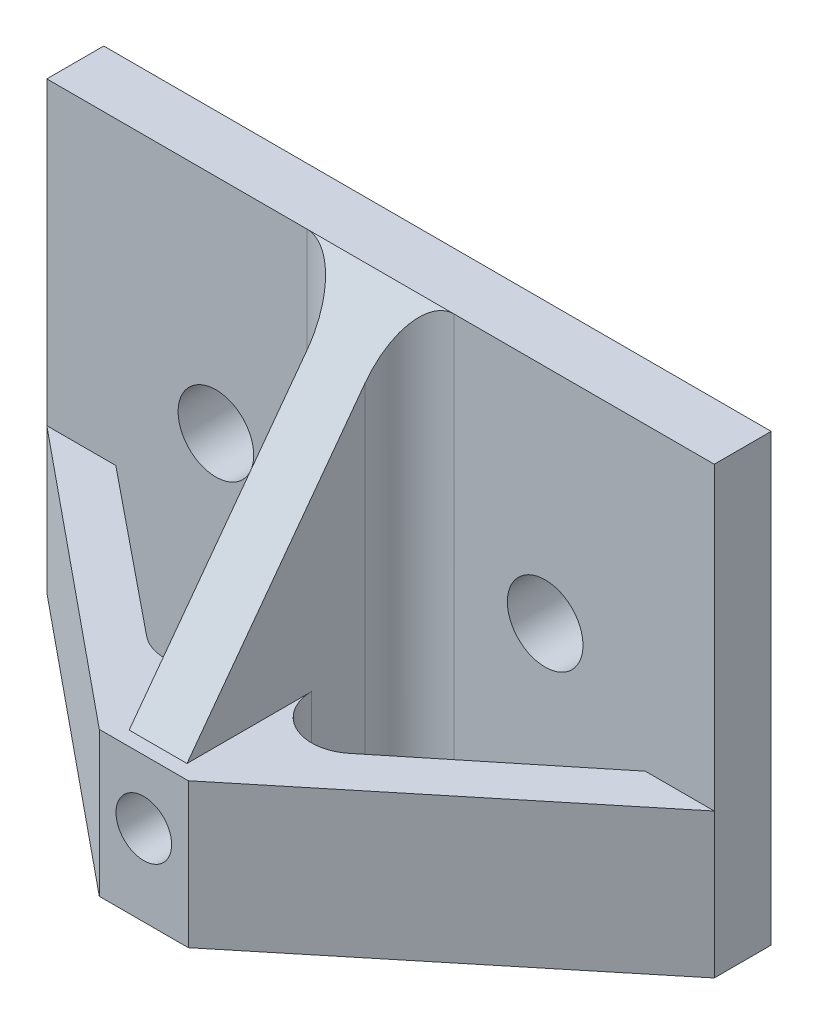
ISO-10303-21;
HEADER;
FILE_DESCRIPTION(('STEP AP214'),'2;1');
FILE_NAME('part.step','',(''),(''),'','','');
FILE_SCHEMA(('AUTOMOTIVE_DESIGN { 1 0 10303 214 1 1 1 1 }'));
ENDSEC;
DATA;
#1=APPLICATION_CONTEXT('core data for automotive mechanical design processes');
#2=APPLICATION_PROTOCOL_DEFINITION('international standard','automotive_design',2000,#1);
#3=PRODUCT_CONTEXT('',#1,'mechanical');
#4=PRODUCT('Part','Part','',(#3));
#5=PRODUCT_RELATED_PRODUCT_CATEGORY('part','',(#4));
#6=PRODUCT_DEFINITION_FORMATION('','',#4);
#7=PRODUCT_DEFINITION_CONTEXT('part definition',#1,'design');
#8=PRODUCT_DEFINITION('design','',#6,#7);
#9=PRODUCT_DEFINITION_SHAPE('','',#8);
#10=(LENGTH_UNIT() NAMED_UNIT(*) SI_UNIT(.MILLI.,.METRE.));
#11=(NAMED_UNIT(*) PLANE_ANGLE_UNIT() SI_UNIT($,.RADIAN.));
#12=(NAMED_UNIT(*) SI_UNIT($,.STERADIAN.) SOLID_ANGLE_UNIT());
#13=UNCERTAINTY_MEASURE_WITH_UNIT(LENGTH_MEASURE(1.E-05),#10,'distance_accuracy_value','');
#14=(GEOMETRIC_REPRESENTATION_CONTEXT(3) GLOBAL_UNCERTAINTY_ASSIGNED_CONTEXT((#13)) GLOBAL_UNIT_ASSIGNED_CONTEXT((#10,
#11,#12)) REPRESENTATION_CONTEXT('',''));
#15=CARTESIAN_POINT('',(0.,0.,0.));
#16=DIRECTION('',(0.,0.,1.));
#17=DIRECTION('',(1.,0.,0.));
#18=AXIS2_PLACEMENT_3D('',#15,#16,#17);
#19=CARTESIAN_POINT('',(-19.05,25.4,-8.382));
#20=DIRECTION('',(1.,0.,0.));
#21=DIRECTION('',(0.,0.,-1.));
#22=AXIS2_PLACEMENT_3D('',#19,#20,#21);
#23=PLANE('',#22);
#24=DIRECTION('',(0.,0.,1.));
#25=VECTOR('',#24,1.);
#26=CARTESIAN_POINT('',(-19.05,0.,-8.382));
#27=LINE('',#26,#25);
#28=CARTESIAN_POINT('',(-19.05,0.,-8.382));
#29=VERTEX_POINT('',#28);
#30=CARTESIAN_POINT('',(-19.05,0.,-5.13261416393379));
#31=VERTEX_POINT('',#30);
#32=EDGE_CURVE('E234',#29,#31,#27,.T.);
#33=ORIENTED_EDGE('',*,*,#32,.T.);
#34=DIRECTION('',(0.,-1.,0.));
#35=VECTOR('',#34,1.);
#36=CARTESIAN_POINT('',(-19.05,25.4,-5.13261416393379));
#37=LINE('',#36,#35);
#38=CARTESIAN_POINT('',(-19.05,8.255,-5.13261416393379));
#39=VERTEX_POINT('',#38);
#40=EDGE_CURVE('E231',#39,#31,#37,.T.);
#41=ORIENTED_EDGE('',*,*,#40,.F.);
#42=CARTESIAN_POINT('',(-19.05,25.4,-5.13261416393379));
#43=VERTEX_POINT('',#42);
#44=EDGE_CURVE('E235',#43,#39,#37,.T.);
#45=ORIENTED_EDGE('',*,*,#44,.F.);
#46=DIRECTION('',(0.,0.,1.));
#47=VECTOR('',#46,1.);
#48=CARTESIAN_POINT('',(-19.05,25.4,-8.382));
#49=LINE('',#48,#47);
#50=CARTESIAN_POINT('',(-19.05,25.4,-8.382));
#51=VERTEX_POINT('',#50);
#52=EDGE_CURVE('E194',#51,#43,#49,.T.);
#53=ORIENTED_EDGE('',*,*,#52,.F.);
#54=DIRECTION('',(0.,-1.,0.));
#55=VECTOR('',#54,1.);
#56=CARTESIAN_POINT('',(-19.05,25.4,-8.382));
#57=LINE('',#56,#55);
#58=EDGE_CURVE('E243',#51,#29,#57,.T.);
#59=ORIENTED_EDGE('',*,*,#58,.T.);
#60=EDGE_LOOP('',(#33,#41,#45,#53,#59));
#61=FACE_BOUND('',#60,.T.);
#62=ADVANCED_FACE('F33',(#61),#23,.F.);
#63=CARTESIAN_POINT('',(19.05,25.4,8.382));
#64=DIRECTION('',(0.,0.,-1.));
#65=DIRECTION('',(-1.,0.,0.));
#66=AXIS2_PLACEMENT_3D('',#63,#64,#65);
#67=PLANE('',#66);
#68=CARTESIAN_POINT('',(0.,4.62310389310775,8.382));
#69=DIRECTION('',(0.,0.,1.));
#70=DIRECTION('',(1.,0.,0.));
#71=AXIS2_PLACEMENT_3D('',#68,#69,#70);
#72=CIRCLE('',#71,1.5875);
#73=CARTESIAN_POINT('',(1.5875,4.62310389310775,8.382));
#74=VERTEX_POINT('',#73);
#75=EDGE_CURVE('E368',#74,#74,#72,.T.);
#76=ORIENTED_EDGE('',*,*,#75,.F.);
#77=EDGE_LOOP('',(#76));
#78=FACE_BOUND('',#77,.T.);
#79=DIRECTION('',(-1.,0.,0.));
#80=VECTOR('',#79,1.);
#81=CARTESIAN_POINT('',(19.05,8.255,8.382));
#82=LINE('',#81,#80);
#83=CARTESIAN_POINT('',(2.54,8.255,8.382));
#84=VERTEX_POINT('',#83);
#85=CARTESIAN_POINT('',(-2.54,8.255,8.382));
#86=VERTEX_POINT('',#85);
#87=EDGE_CURVE('E288',#84,#86,#82,.T.);
#88=ORIENTED_EDGE('',*,*,#87,.T.);
#89=DIRECTION('',(0.,-1.,0.));
#90=VECTOR('',#89,1.);
#91=CARTESIAN_POINT('',(-2.54,25.4,8.382));
#92=LINE('',#91,#90);
#93=CARTESIAN_POINT('',(-2.54,0.,8.382));
#94=VERTEX_POINT('',#93);
#95=EDGE_CURVE('E232',#86,#94,#92,.T.);
#96=ORIENTED_EDGE('',*,*,#95,.T.);
#97=DIRECTION('',(1.,0.,0.));
#98=VECTOR('',#97,1.);
#99=CARTESIAN_POINT('',(19.05,0.,8.382));
#100=LINE('',#99,#98);
#101=CARTESIAN_POINT('',(2.54000000000001,0.,8.382));
#102=VERTEX_POINT('',#101);
#103=EDGE_CURVE('E246',#94,#102,#100,.T.);
#104=ORIENTED_EDGE('',*,*,#103,.T.);
#105=DIRECTION('',(0.,-1.,0.));
#106=VECTOR('',#105,1.);
#107=CARTESIAN_POINT('',(2.54,25.4,8.382));
#108=LINE('',#107,#106);
#109=EDGE_CURVE('E223',#84,#102,#108,.T.);
#110=ORIENTED_EDGE('',*,*,#109,.F.);
#111=EDGE_LOOP('',(#88,#96,#104,#110));
#112=FACE_BOUND('',#111,.T.);
#113=ADVANCED_FACE('F382',(#78,#112),#67,.F.);
#114=CARTESIAN_POINT('',(19.05,25.4,-8.382));
#115=DIRECTION('',(-1.,0.,0.));
#116=DIRECTION('',(0.,0.,1.));
#117=AXIS2_PLACEMENT_3D('',#114,#115,#116);
#118=PLANE('',#117);
#119=DIRECTION('',(0.,0.,-1.));
#120=VECTOR('',#119,1.);
#121=CARTESIAN_POINT('',(19.05,25.4,-8.382));
#122=LINE('',#121,#120);
#123=CARTESIAN_POINT('',(19.05,25.4,-5.13261416393379));
#124=VERTEX_POINT('',#123);
#125=CARTESIAN_POINT('',(19.05,25.4,-8.382));
#126=VERTEX_POINT('',#125);
#127=EDGE_CURVE('E238',#124,#126,#122,.T.);
#128=ORIENTED_EDGE('',*,*,#127,.F.);
#129=DIRECTION('',(0.,-1.,0.));
#130=VECTOR('',#129,1.);
#131=CARTESIAN_POINT('',(19.05,25.4,-5.13261416393379));
#132=LINE('',#131,#130);
#133=CARTESIAN_POINT('',(19.05,8.255,-5.13261416393379));
#134=VERTEX_POINT('',#133);
#135=EDGE_CURVE('E226',#124,#134,#132,.T.);
#136=ORIENTED_EDGE('',*,*,#135,.T.);
#137=CARTESIAN_POINT('',(19.05,0.,-5.13261416393379));
#138=VERTEX_POINT('',#137);
#139=EDGE_CURVE('E222',#134,#138,#132,.T.);
#140=ORIENTED_EDGE('',*,*,#139,.T.);
#141=DIRECTION('',(0.,0.,-1.));
#142=VECTOR('',#141,1.);
#143=CARTESIAN_POINT('',(19.05,0.,-8.382));
#144=LINE('',#143,#142);
#145=CARTESIAN_POINT('',(19.05,0.,-8.382));
#146=VERTEX_POINT('',#145);
#147=EDGE_CURVE('E249',#138,#146,#144,.T.);
#148=ORIENTED_EDGE('',*,*,#147,.T.);
#149=DIRECTION('',(0.,-1.,0.));
#150=VECTOR('',#149,1.);
#151=CARTESIAN_POINT('',(19.05,25.4,-8.382));
#152=LINE('',#151,#150);
#153=EDGE_CURVE('E41',#126,#146,#152,.T.);
#154=ORIENTED_EDGE('',*,*,#153,.F.);
#155=EDGE_LOOP('',(#128,#136,#140,#148,#154));
#156=FACE_BOUND('',#155,.T.);
#157=ADVANCED_FACE('F339',(#156),#118,.F.);
#158=CARTESIAN_POINT('',(19.05,25.4,-8.382));
#159=DIRECTION('',(0.,0.,1.));
#160=DIRECTION('',(1.,0.,0.));
#161=AXIS2_PLACEMENT_3D('',#158,#159,#160);
#162=PLANE('',#161);
#163=CARTESIAN_POINT('',(-9.398,12.7,-8.382));
#164=DIRECTION('',(0.,0.,-1.));
#165=DIRECTION('',(1.,0.,0.));
#166=AXIS2_PLACEMENT_3D('',#163,#164,#165);
#167=CIRCLE('',#166,2.159);
#168=CARTESIAN_POINT('',(-7.239,12.7,-8.382));
#169=VERTEX_POINT('',#168);
#170=EDGE_CURVE('E269',#169,#169,#167,.T.);
#171=ORIENTED_EDGE('',*,*,#170,.F.);
#172=EDGE_LOOP('',(#171));
#173=FACE_BOUND('',#172,.T.);
#174=CARTESIAN_POINT('',(9.398,12.7,-8.382));
#175=DIRECTION('',(0.,0.,-1.));
#176=DIRECTION('',(-1.,0.,0.));
#177=AXIS2_PLACEMENT_3D('',#174,#175,#176);
#178=CIRCLE('',#177,2.159);
#179=CARTESIAN_POINT('',(7.239,12.7,-8.382));
#180=VERTEX_POINT('',#179);
#181=EDGE_CURVE('E258',#180,#180,#178,.T.);
#182=ORIENTED_EDGE('',*,*,#181,.F.);
#183=EDGE_LOOP('',(#182));
#184=FACE_BOUND('',#183,.T.);
#185=DIRECTION('',(-1.,0.,0.));
#186=VECTOR('',#185,1.);
#187=CARTESIAN_POINT('',(19.05,0.,-8.382));
#188=LINE('',#187,#186);
#189=EDGE_CURVE('E239',#146,#29,#188,.T.);
#190=ORIENTED_EDGE('',*,*,#189,.T.);
#191=ORIENTED_EDGE('',*,*,#58,.F.);
#192=DIRECTION('',(-1.,0.,0.));
#193=VECTOR('',#192,1.);
#194=CARTESIAN_POINT('',(19.05,25.4,-8.382));
#195=LINE('',#194,#193);
#196=EDGE_CURVE('E241',#126,#51,#195,.T.);
#197=ORIENTED_EDGE('',*,*,#196,.F.);
#198=ORIENTED_EDGE('',*,*,#153,.T.);
#199=EDGE_LOOP('',(#190,#191,#197,#198));
#200=FACE_BOUND('',#199,.T.);
#201=ADVANCED_FACE('F343',(#173,#184,#200),#162,.F.);
#202=CARTESIAN_POINT('',(0.,25.4,0.));
#203=DIRECTION('',(0.,-1.,0.));
#204=DIRECTION('',(0.,0.,-1.));
#205=AXIS2_PLACEMENT_3D('',#202,#203,#204);
#206=PLANE('',#205);
#207=DIRECTION('',(1.,0.,0.));
#208=VECTOR('',#207,1.);
#209=CARTESIAN_POINT('',(-4.191,25.4,-5.13261416393379));
#210=LINE('',#209,#208);
#211=CARTESIAN_POINT('',(-4.191,25.4,-5.13261416393379));
#212=VERTEX_POINT('',#211);
#213=EDGE_CURVE('E184',#43,#212,#210,.T.);
#214=ORIENTED_EDGE('',*,*,#213,.T.);
#215=DIRECTION('',(1.,0.,0.));
#216=VECTOR('',#215,1.);
#217=CARTESIAN_POINT('',(-19.05,25.4,-5.13261416393378));
#218=LINE('',#217,#216);
#219=CARTESIAN_POINT('',(4.191,25.4,-5.13261416393379));
#220=VERTEX_POINT('',#219);
#221=EDGE_CURVE('E158',#212,#220,#218,.T.);
#222=ORIENTED_EDGE('',*,*,#221,.T.);
#223=DIRECTION('',(1.,0.,0.));
#224=VECTOR('',#223,1.);
#225=CARTESIAN_POINT('',(4.191,25.4,-5.13261416393379));
#226=LINE('',#225,#224);
#227=EDGE_CURVE('E291',#220,#124,#226,.T.);
#228=ORIENTED_EDGE('',*,*,#227,.T.);
#229=ORIENTED_EDGE('',*,*,#127,.T.);
#230=ORIENTED_EDGE('',*,*,#196,.T.);
#231=ORIENTED_EDGE('',*,*,#52,.T.);
#232=EDGE_LOOP('',(#214,#222,#228,#229,#230,#231));
#233=FACE_BOUND('',#232,.T.);
#234=ADVANCED_FACE('F192',(#233),#206,.F.);
#235=CARTESIAN_POINT('',(0.,0.,0.));
#236=DIRECTION('',(0.,-1.,0.));
#237=DIRECTION('',(0.,0.,-1.));
#238=AXIS2_PLACEMENT_3D('',#235,#236,#237);
#239=PLANE('',#238);
#240=CARTESIAN_POINT('',(4.191,0.,0.455385836066213));
#241=DIRECTION('',(0.,-1.,0.));
#242=DIRECTION('',(0.,0.,1.));
#243=AXIS2_PLACEMENT_3D('',#240,#241,#242);
#244=CIRCLE('',#243,2.54);
#245=CARTESIAN_POINT('',(5.79099515260645,0.,2.42810363434246));
#246=VERTEX_POINT('',#245);
#247=CARTESIAN_POINT('',(1.651,0.,0.455385836066213));
#248=VERTEX_POINT('',#247);
#249=EDGE_CURVE('E290',#246,#248,#244,.T.);
#250=ORIENTED_EDGE('',*,*,#249,.F.);
#251=DIRECTION('',(-0.776660550502457,0.,0.629919351419862));
#252=VECTOR('',#251,1.);
#253=CARTESIAN_POINT('',(15.113,0.,-5.13261416393379));
#254=LINE('',#253,#252);
#255=CARTESIAN_POINT('',(15.113,0.,-5.13261416393379));
#256=VERTEX_POINT('',#255);
#257=EDGE_CURVE('E293',#256,#246,#254,.T.);
#258=ORIENTED_EDGE('',*,*,#257,.F.);
#259=DIRECTION('',(1.,0.,0.));
#260=VECTOR('',#259,1.);
#261=CARTESIAN_POINT('',(4.191,0.,-5.13261416393379));
#262=LINE('',#261,#260);
#263=CARTESIAN_POINT('',(4.191,0.,-5.13261416393379));
#264=VERTEX_POINT('',#263);
#265=EDGE_CURVE('E302',#264,#256,#262,.T.);
#266=ORIENTED_EDGE('',*,*,#265,.F.);
#267=CARTESIAN_POINT('',(4.191,0.,-2.59261416393379));
#268=DIRECTION('',(0.,-1.,0.));
#269=DIRECTION('',(0.,0.,-1.));
#270=AXIS2_PLACEMENT_3D('',#267,#268,#269);
#271=CIRCLE('',#270,2.54);
#272=CARTESIAN_POINT('',(1.651,0.,-2.59261416393379));
#273=VERTEX_POINT('',#272);
#274=EDGE_CURVE('E299',#273,#264,#271,.T.);
#275=ORIENTED_EDGE('',*,*,#274,.F.);
#276=DIRECTION('',(0.,0.,-1.));
#277=VECTOR('',#276,1.);
#278=CARTESIAN_POINT('',(1.651,0.,0.455385836066213));
#279=LINE('',#278,#277);
#280=EDGE_CURVE('E296',#248,#273,#279,.T.);
#281=ORIENTED_EDGE('',*,*,#280,.F.);
#282=EDGE_LOOP('',(#250,#258,#266,#275,#281));
#283=FACE_BOUND('',#282,.T.);
#284=CARTESIAN_POINT('',(-4.191,0.,0.455385836066213));
#285=DIRECTION('',(0.,-1.,0.));
#286=DIRECTION('',(0.,0.,-1.));
#287=AXIS2_PLACEMENT_3D('',#284,#285,#286);
#288=CIRCLE('',#287,2.54);
#289=CARTESIAN_POINT('',(-1.651,0.,0.455385836066213));
#290=VERTEX_POINT('',#289);
#291=CARTESIAN_POINT('',(-5.79099515260645,0.,2.42810363434246));
#292=VERTEX_POINT('',#291);
#293=EDGE_CURVE('E206',#290,#292,#288,.T.);
#294=ORIENTED_EDGE('',*,*,#293,.F.);
#295=DIRECTION('',(0.,0.,1.));
#296=VECTOR('',#295,1.);
#297=CARTESIAN_POINT('',(-1.651,0.,0.455385836066213));
#298=LINE('',#297,#296);
#299=CARTESIAN_POINT('',(-1.651,0.,-2.59261416393379));
#300=VERTEX_POINT('',#299);
#301=EDGE_CURVE('E196',#300,#290,#298,.T.);
#302=ORIENTED_EDGE('',*,*,#301,.F.);
#303=CARTESIAN_POINT('',(-4.191,0.,-2.59261416393379));
#304=DIRECTION('',(0.,-1.,0.));
#305=DIRECTION('',(0.,0.,1.));
#306=AXIS2_PLACEMENT_3D('',#303,#304,#305);
#307=CIRCLE('',#306,2.54);
#308=CARTESIAN_POINT('',(-4.191,0.,-5.13261416393379));
#309=VERTEX_POINT('',#308);
#310=EDGE_CURVE('E200',#309,#300,#307,.T.);
#311=ORIENTED_EDGE('',*,*,#310,.F.);
#312=DIRECTION('',(1.,0.,0.));
#313=VECTOR('',#312,1.);
#314=CARTESIAN_POINT('',(-4.191,0.,-5.13261416393379));
#315=LINE('',#314,#313);
#316=CARTESIAN_POINT('',(-15.113,0.,-5.13261416393379));
#317=VERTEX_POINT('',#316);
#318=EDGE_CURVE('E187',#317,#309,#315,.T.);
#319=ORIENTED_EDGE('',*,*,#318,.F.);
#320=DIRECTION('',(-0.776660550502457,0.,-0.629919351419862));
#321=VECTOR('',#320,1.);
#322=CARTESIAN_POINT('',(-15.113,0.,-5.13261416393379));
#323=LINE('',#322,#321);
#324=EDGE_CURVE('E209',#292,#317,#323,.T.);
#325=ORIENTED_EDGE('',*,*,#324,.F.);
#326=EDGE_LOOP('',(#294,#302,#311,#319,#325));
#327=FACE_BOUND('',#326,.T.);
#328=DIRECTION('',(0.773809523809524,0.,-0.633418361639192));
#329=VECTOR('',#328,1.);
#330=CARTESIAN_POINT('',(2.54,0.,8.382));
#331=LINE('',#330,#329);
#332=EDGE_CURVE('E217',#102,#138,#331,.T.);
#333=ORIENTED_EDGE('',*,*,#332,.F.);
#334=ORIENTED_EDGE('',*,*,#103,.F.);
#335=DIRECTION('',(0.773809523809524,0.,0.633418361639192));
#336=VECTOR('',#335,1.);
#337=CARTESIAN_POINT('',(-2.54,0.,8.382));
#338=LINE('',#337,#336);
#339=EDGE_CURVE('E225',#31,#94,#338,.T.);
#340=ORIENTED_EDGE('',*,*,#339,.F.);
#341=ORIENTED_EDGE('',*,*,#32,.F.);
#342=ORIENTED_EDGE('',*,*,#189,.F.);
#343=ORIENTED_EDGE('',*,*,#147,.F.);
#344=EDGE_LOOP('',(#333,#334,#340,#341,#342,#343));
#345=FACE_BOUND('',#344,.T.);
#346=ADVANCED_FACE('F324',(#283,#327,#345),#239,.T.);
#347=CARTESIAN_POINT('',(-2.54,25.4,8.382));
#348=DIRECTION('',(0.633418361639192,0.,-0.773809523809524));
#349=DIRECTION('',(-0.773809523809524,0.,-0.633418361639192));
#350=AXIS2_PLACEMENT_3D('',#347,#348,#349);
#351=PLANE('',#350);
#352=ORIENTED_EDGE('',*,*,#95,.F.);
#353=DIRECTION('',(-0.773809523809524,0.,-0.633418361639192));
#354=VECTOR('',#353,1.);
#355=CARTESIAN_POINT('',(-2.54,8.255,8.382));
#356=LINE('',#355,#354);
#357=EDGE_CURVE('E275',#86,#39,#356,.T.);
#358=ORIENTED_EDGE('',*,*,#357,.T.);
#359=ORIENTED_EDGE('',*,*,#40,.T.);
#360=ORIENTED_EDGE('',*,*,#339,.T.);
#361=EDGE_LOOP('',(#352,#358,#359,#360));
#362=FACE_BOUND('',#361,.T.);
#363=ADVANCED_FACE('F390',(#362),#351,.F.);
#364=CARTESIAN_POINT('',(2.54,25.4,8.382));
#365=DIRECTION('',(-0.633418361639192,0.,-0.773809523809524));
#366=DIRECTION('',(-0.773809523809524,0.,0.633418361639192));
#367=AXIS2_PLACEMENT_3D('',#364,#365,#366);
#368=PLANE('',#367);
#369=ORIENTED_EDGE('',*,*,#139,.F.);
#370=DIRECTION('',(-0.773809523809524,0.,0.633418361639192));
#371=VECTOR('',#370,1.);
#372=CARTESIAN_POINT('',(2.54,8.255,8.382));
#373=LINE('',#372,#371);
#374=EDGE_CURVE('E286',#134,#84,#373,.T.);
#375=ORIENTED_EDGE('',*,*,#374,.T.);
#376=ORIENTED_EDGE('',*,*,#109,.T.);
#377=ORIENTED_EDGE('',*,*,#332,.T.);
#378=EDGE_LOOP('',(#369,#375,#376,#377));
#379=FACE_BOUND('',#378,.T.);
#380=ADVANCED_FACE('F396',(#379),#368,.F.);
#381=CARTESIAN_POINT('',(-4.191,25.4,0.455385836066213));
#382=DIRECTION('',(0.,-1.,0.));
#383=DIRECTION('',(0.,0.,-1.));
#384=AXIS2_PLACEMENT_3D('',#381,#382,#383);
#385=CYLINDRICAL_SURFACE('',#384,2.54);
#386=DIRECTION('',(0.,-1.,0.));
#387=VECTOR('',#386,1.);
#388=CARTESIAN_POINT('',(-5.79099515260645,25.4,2.42810363434246));
#389=LINE('',#388,#387);
#390=CARTESIAN_POINT('',(-5.79099515260645,8.255,2.42810363434246));
#391=VERTEX_POINT('',#390);
#392=EDGE_CURVE('E195',#391,#292,#389,.T.);
#393=ORIENTED_EDGE('',*,*,#392,.F.);
#394=CARTESIAN_POINT('',(-4.191,8.255,0.455385836066213));
#395=DIRECTION('',(0.,-1.,0.));
#396=DIRECTION('',(0.,0.,-1.));
#397=AXIS2_PLACEMENT_3D('',#394,#395,#396);
#398=CIRCLE('',#397,2.54);
#399=CARTESIAN_POINT('',(-1.651,8.255,0.455385836066213));
#400=VERTEX_POINT('',#399);
#401=EDGE_CURVE('E49',#391,#400,#398,.F.);
#402=ORIENTED_EDGE('',*,*,#401,.T.);
#403=DIRECTION('',(0.,-1.,0.));
#404=VECTOR('',#403,1.);
#405=CARTESIAN_POINT('',(-1.651,25.4,0.455385836066213));
#406=LINE('',#405,#404);
#407=EDGE_CURVE('E215',#400,#290,#406,.T.);
#408=ORIENTED_EDGE('',*,*,#407,.T.);
#409=ORIENTED_EDGE('',*,*,#293,.T.);
#410=EDGE_LOOP('',(#393,#402,#408,#409));
#411=FACE_BOUND('',#410,.T.);
#412=ADVANCED_FACE('F400',(#411),#385,.F.);
#413=CARTESIAN_POINT('',(-1.651,25.4,0.455385836066213));
#414=DIRECTION('',(1.,0.,0.));
#415=DIRECTION('',(0.,0.,-1.));
#416=AXIS2_PLACEMENT_3D('',#413,#414,#415);
#417=PLANE('',#416);
#418=DIRECTION('',(0.,0.,-1.));
#419=VECTOR('',#418,1.);
#420=CARTESIAN_POINT('',(-1.651,8.255,0.455385836066213));
#421=LINE('',#420,#419);
#422=CARTESIAN_POINT('',(-1.651,8.255,7.56675082019042));
#423=VERTEX_POINT('',#422);
#424=EDGE_CURVE('E262',#423,#400,#421,.T.);
#425=ORIENTED_EDGE('',*,*,#424,.F.);
#426=DIRECTION('',(0.,0.803571428571429,-0.595208332589248));
#427=VECTOR('',#426,1.);
#428=CARTESIAN_POINT('',(-1.651,22.7273020122698,-3.15293686801542));
#429=LINE('',#428,#427);
#430=CARTESIAN_POINT('',(-1.651,21.9708285371402,-2.59261416393379));
#431=VERTEX_POINT('',#430);
#432=EDGE_CURVE('E179',#423,#431,#429,.T.);
#433=ORIENTED_EDGE('',*,*,#432,.T.);
#434=DIRECTION('',(0.,-1.,0.));
#435=VECTOR('',#434,1.);
#436=CARTESIAN_POINT('',(-1.651,25.4,-2.59261416393379));
#437=LINE('',#436,#435);
#438=EDGE_CURVE('E178',#431,#300,#437,.T.);
#439=ORIENTED_EDGE('',*,*,#438,.T.);
#440=ORIENTED_EDGE('',*,*,#301,.T.);
#441=ORIENTED_EDGE('',*,*,#407,.F.);
#442=EDGE_LOOP('',(#425,#433,#439,#440,#441));
#443=FACE_BOUND('',#442,.T.);
#444=ADVANCED_FACE('F360',(#443),#417,.F.);
#445=CARTESIAN_POINT('',(-4.191,25.4,-2.59261416393379));
#446=DIRECTION('',(0.,-1.,0.));
#447=DIRECTION('',(0.,0.,-1.));
#448=AXIS2_PLACEMENT_3D('',#445,#446,#447);
#449=CYLINDRICAL_SURFACE('',#448,2.54);
#450=ORIENTED_EDGE('',*,*,#438,.F.);
#451=CARTESIAN_POINT('',(-4.191,21.9708285371402,-2.59261416393379));
#452=DIRECTION('',(0.,-0.595208332589248,-0.803571428571429));
#453=DIRECTION('',(0.,-0.803571428571429,0.595208332589248));
#454=AXIS2_PLACEMENT_3D('',#451,#452,#453);
#455=ELLIPSE('',#454,4.26741337600334,2.54);
#456=EDGE_CURVE('E161',#431,#212,#455,.F.);
#457=ORIENTED_EDGE('',*,*,#456,.T.);
#458=DIRECTION('',(0.,-1.,0.));
#459=VECTOR('',#458,1.);
#460=CARTESIAN_POINT('',(-4.191,25.4,-5.13261416393379));
#461=LINE('',#460,#459);
#462=EDGE_CURVE('E176',#212,#309,#461,.T.);
#463=ORIENTED_EDGE('',*,*,#462,.T.);
#464=ORIENTED_EDGE('',*,*,#310,.T.);
#465=EDGE_LOOP('',(#450,#457,#463,#464));
#466=FACE_BOUND('',#465,.T.);
#467=ADVANCED_FACE('F174',(#466),#449,.F.);
#468=CARTESIAN_POINT('',(-4.191,25.4,-5.13261416393379));
#469=DIRECTION('',(0.,0.,-1.));
#470=DIRECTION('',(-1.,0.,0.));
#471=AXIS2_PLACEMENT_3D('',#468,#469,#470);
#472=PLANE('',#471);
#473=CARTESIAN_POINT('',(-9.398,12.7,-5.13261416393379));
#474=DIRECTION('',(0.,0.,-1.));
#475=DIRECTION('',(-1.,0.,0.));
#476=AXIS2_PLACEMENT_3D('',#473,#474,#475);
#477=CIRCLE('',#476,2.159);
#478=CARTESIAN_POINT('',(-11.557,12.7,-5.13261416393379));
#479=VERTEX_POINT('',#478);
#480=EDGE_CURVE('E36',#479,#479,#477,.T.);
#481=ORIENTED_EDGE('',*,*,#480,.T.);
#482=EDGE_LOOP('',(#481));
#483=FACE_BOUND('',#482,.T.);
#484=ORIENTED_EDGE('',*,*,#318,.T.);
#485=ORIENTED_EDGE('',*,*,#462,.F.);
#486=ORIENTED_EDGE('',*,*,#213,.F.);
#487=ORIENTED_EDGE('',*,*,#44,.T.);
#488=DIRECTION('',(-1.,0.,0.));
#489=VECTOR('',#488,1.);
#490=CARTESIAN_POINT('',(-19.05,8.255,-5.13261416393379));
#491=LINE('',#490,#489);
#492=CARTESIAN_POINT('',(-15.113,8.255,-5.13261416393379));
#493=VERTEX_POINT('',#492);
#494=EDGE_CURVE('E257',#493,#39,#491,.T.);
#495=ORIENTED_EDGE('',*,*,#494,.F.);
#496=DIRECTION('',(0.,-1.,0.));
#497=VECTOR('',#496,1.);
#498=CARTESIAN_POINT('',(-15.113,25.4,-5.13261416393379));
#499=LINE('',#498,#497);
#500=EDGE_CURVE('E189',#493,#317,#499,.T.);
#501=ORIENTED_EDGE('',*,*,#500,.T.);
#502=EDGE_LOOP('',(#484,#485,#486,#487,#495,#501));
#503=FACE_BOUND('',#502,.T.);
#504=ADVANCED_FACE('F182',(#483,#503),#472,.F.);
#505=CARTESIAN_POINT('',(-15.113,25.4,-5.13261416393379));
#506=DIRECTION('',(-0.629919351419862,0.,0.776660550502457));
#507=DIRECTION('',(0.776660550502457,0.,0.629919351419862));
#508=AXIS2_PLACEMENT_3D('',#505,#506,#507);
#509=PLANE('',#508);
#510=ORIENTED_EDGE('',*,*,#500,.F.);
#511=DIRECTION('',(0.776660550502457,0.,0.629919351419862));
#512=VECTOR('',#511,1.);
#513=CARTESIAN_POINT('',(-15.113,8.255,-5.13261416393379));
#514=LINE('',#513,#512);
#515=EDGE_CURVE('E11',#493,#391,#514,.T.);
#516=ORIENTED_EDGE('',*,*,#515,.T.);
#517=ORIENTED_EDGE('',*,*,#392,.T.);
#518=ORIENTED_EDGE('',*,*,#324,.T.);
#519=EDGE_LOOP('',(#510,#516,#517,#518));
#520=FACE_BOUND('',#519,.T.);
#521=ADVANCED_FACE('F351',(#520),#509,.F.);
#522=CARTESIAN_POINT('',(4.191,25.4,0.455385836066213));
#523=DIRECTION('',(0.,-1.,0.));
#524=DIRECTION('',(0.,0.,-1.));
#525=AXIS2_PLACEMENT_3D('',#522,#523,#524);
#526=CYLINDRICAL_SURFACE('',#525,2.54);
#527=DIRECTION('',(0.,-1.,0.));
#528=VECTOR('',#527,1.);
#529=CARTESIAN_POINT('',(1.651,25.4,0.455385836066213));
#530=LINE('',#529,#528);
#531=CARTESIAN_POINT('',(1.651,8.255,0.455385836066213));
#532=VERTEX_POINT('',#531);
#533=EDGE_CURVE('E204',#532,#248,#530,.T.);
#534=ORIENTED_EDGE('',*,*,#533,.F.);
#535=CARTESIAN_POINT('',(4.191,8.255,0.455385836066213));
#536=DIRECTION('',(0.,-1.,0.));
#537=DIRECTION('',(0.,0.,-1.));
#538=AXIS2_PLACEMENT_3D('',#535,#536,#537);
#539=CIRCLE('',#538,2.54);
#540=CARTESIAN_POINT('',(5.79099515260645,8.255,2.42810363434246));
#541=VERTEX_POINT('',#540);
#542=EDGE_CURVE('E283',#532,#541,#539,.F.);
#543=ORIENTED_EDGE('',*,*,#542,.T.);
#544=DIRECTION('',(0.,-1.,0.));
#545=VECTOR('',#544,1.);
#546=CARTESIAN_POINT('',(5.79099515260645,25.4,2.42810363434246));
#547=LINE('',#546,#545);
#548=EDGE_CURVE('E210',#541,#246,#547,.T.);
#549=ORIENTED_EDGE('',*,*,#548,.T.);
#550=ORIENTED_EDGE('',*,*,#249,.T.);
#551=EDGE_LOOP('',(#534,#543,#549,#550));
#552=FACE_BOUND('',#551,.T.);
#553=ADVANCED_FACE('F320',(#552),#526,.F.);
#554=CARTESIAN_POINT('',(15.113,25.4,-5.13261416393379));
#555=DIRECTION('',(0.629919351419862,0.,0.776660550502457));
#556=DIRECTION('',(0.776660550502457,0.,-0.629919351419862));
#557=AXIS2_PLACEMENT_3D('',#554,#555,#556);
#558=PLANE('',#557);
#559=ORIENTED_EDGE('',*,*,#548,.F.);
#560=DIRECTION('',(0.776660550502457,0.,-0.629919351419862));
#561=VECTOR('',#560,1.);
#562=CARTESIAN_POINT('',(15.113,8.255,-5.13261416393379));
#563=LINE('',#562,#561);
#564=CARTESIAN_POINT('',(15.113,8.255,-5.13261416393379));
#565=VERTEX_POINT('',#564);
#566=EDGE_CURVE('E280',#541,#565,#563,.T.);
#567=ORIENTED_EDGE('',*,*,#566,.T.);
#568=DIRECTION('',(0.,-1.,0.));
#569=VECTOR('',#568,1.);
#570=CARTESIAN_POINT('',(15.113,25.4,-5.13261416393379));
#571=LINE('',#570,#569);
#572=EDGE_CURVE('E308',#565,#256,#571,.T.);
#573=ORIENTED_EDGE('',*,*,#572,.T.);
#574=ORIENTED_EDGE('',*,*,#257,.T.);
#575=EDGE_LOOP('',(#559,#567,#573,#574));
#576=FACE_BOUND('',#575,.T.);
#577=ADVANCED_FACE('F398',(#576),#558,.F.);
#578=CARTESIAN_POINT('',(4.191,25.4,-5.13261416393379));
#579=DIRECTION('',(0.,0.,-1.));
#580=DIRECTION('',(-1.,0.,0.));
#581=AXIS2_PLACEMENT_3D('',#578,#579,#580);
#582=PLANE('',#581);
#583=CARTESIAN_POINT('',(9.398,12.7,-5.13261416393379));
#584=DIRECTION('',(0.,0.,-1.));
#585=DIRECTION('',(-1.,0.,0.));
#586=AXIS2_PLACEMENT_3D('',#583,#584,#585);
#587=CIRCLE('',#586,2.159);
#588=CARTESIAN_POINT('',(7.239,12.7,-5.13261416393379));
#589=VERTEX_POINT('',#588);
#590=EDGE_CURVE('E255',#589,#589,#587,.T.);
#591=ORIENTED_EDGE('',*,*,#590,.T.);
#592=EDGE_LOOP('',(#591));
#593=FACE_BOUND('',#592,.T.);
#594=ORIENTED_EDGE('',*,*,#572,.F.);
#595=DIRECTION('',(-1.,0.,0.));
#596=VECTOR('',#595,1.);
#597=CARTESIAN_POINT('',(19.05,8.255,-5.13261416393379));
#598=LINE('',#597,#596);
#599=EDGE_CURVE('E278',#134,#565,#598,.T.);
#600=ORIENTED_EDGE('',*,*,#599,.F.);
#601=ORIENTED_EDGE('',*,*,#135,.F.);
#602=ORIENTED_EDGE('',*,*,#227,.F.);
#603=DIRECTION('',(0.,-1.,0.));
#604=VECTOR('',#603,1.);
#605=CARTESIAN_POINT('',(4.191,25.4,-5.13261416393379));
#606=LINE('',#605,#604);
#607=EDGE_CURVE('E310',#220,#264,#606,.T.);
#608=ORIENTED_EDGE('',*,*,#607,.T.);
#609=ORIENTED_EDGE('',*,*,#265,.T.);
#610=EDGE_LOOP('',(#594,#600,#601,#602,#608,#609));
#611=FACE_BOUND('',#610,.T.);
#612=ADVANCED_FACE('F332',(#593,#611),#582,.F.);
#613=CARTESIAN_POINT('',(4.191,25.4,-2.59261416393379));
#614=DIRECTION('',(0.,-1.,0.));
#615=DIRECTION('',(0.,0.,-1.));
#616=AXIS2_PLACEMENT_3D('',#613,#614,#615);
#617=CYLINDRICAL_SURFACE('',#616,2.54);
#618=ORIENTED_EDGE('',*,*,#607,.F.);
#619=CARTESIAN_POINT('',(4.191,21.9708285371402,-2.59261416393379));
#620=DIRECTION('',(0.,-0.595208332589248,-0.803571428571429));
#621=DIRECTION('',(0.,-0.803571428571429,0.595208332589248));
#622=AXIS2_PLACEMENT_3D('',#619,#620,#621);
#623=ELLIPSE('',#622,4.26741337600334,2.54);
#624=CARTESIAN_POINT('',(1.651,21.9708285371402,-2.59261416393379));
#625=VERTEX_POINT('',#624);
#626=EDGE_CURVE('E164',#220,#625,#623,.F.);
#627=ORIENTED_EDGE('',*,*,#626,.T.);
#628=DIRECTION('',(0.,-1.,0.));
#629=VECTOR('',#628,1.);
#630=CARTESIAN_POINT('',(1.651,25.4,-2.59261416393379));
#631=LINE('',#630,#629);
#632=EDGE_CURVE('E311',#625,#273,#631,.T.);
#633=ORIENTED_EDGE('',*,*,#632,.T.);
#634=ORIENTED_EDGE('',*,*,#274,.T.);
#635=EDGE_LOOP('',(#618,#627,#633,#634));
#636=FACE_BOUND('',#635,.T.);
#637=ADVANCED_FACE('F327',(#636),#617,.F.);
#638=CARTESIAN_POINT('',(1.651,25.4,0.455385836066213));
#639=DIRECTION('',(-1.,0.,0.));
#640=DIRECTION('',(0.,0.,1.));
#641=AXIS2_PLACEMENT_3D('',#638,#639,#640);
#642=PLANE('',#641);
#643=ORIENTED_EDGE('',*,*,#632,.F.);
#644=DIRECTION('',(0.,-0.803571428571429,0.595208332589248));
#645=VECTOR('',#644,1.);
#646=CARTESIAN_POINT('',(1.651,22.7273020122698,-3.15293686801542));
#647=LINE('',#646,#645);
#648=CARTESIAN_POINT('',(1.651,8.255,7.56675082019042));
#649=VERTEX_POINT('',#648);
#650=EDGE_CURVE('E168',#625,#649,#647,.T.);
#651=ORIENTED_EDGE('',*,*,#650,.T.);
#652=DIRECTION('',(0.,0.,1.));
#653=VECTOR('',#652,1.);
#654=CARTESIAN_POINT('',(1.651,8.255,0.455385836066213));
#655=LINE('',#654,#653);
#656=EDGE_CURVE('E56',#532,#649,#655,.T.);
#657=ORIENTED_EDGE('',*,*,#656,.F.);
#658=ORIENTED_EDGE('',*,*,#533,.T.);
#659=ORIENTED_EDGE('',*,*,#280,.T.);
#660=EDGE_LOOP('',(#643,#651,#657,#658,#659));
#661=FACE_BOUND('',#660,.T.);
#662=ADVANCED_FACE('F315',(#661),#642,.F.);
#663=CARTESIAN_POINT('',(0.,8.255,0.));
#664=DIRECTION('',(0.,-1.,0.));
#665=DIRECTION('',(0.,0.,-1.));
#666=AXIS2_PLACEMENT_3D('',#663,#664,#665);
#667=PLANE('',#666);
#668=ORIENTED_EDGE('',*,*,#656,.T.);
#669=DIRECTION('',(1.,0.,0.));
#670=VECTOR('',#669,1.);
#671=CARTESIAN_POINT('',(-19.05,8.255,7.56675082019042));
#672=LINE('',#671,#670);
#673=EDGE_CURVE('E169',#423,#649,#672,.T.);
#674=ORIENTED_EDGE('',*,*,#673,.F.);
#675=ORIENTED_EDGE('',*,*,#424,.T.);
#676=ORIENTED_EDGE('',*,*,#401,.F.);
#677=ORIENTED_EDGE('',*,*,#515,.F.);
#678=ORIENTED_EDGE('',*,*,#494,.T.);
#679=ORIENTED_EDGE('',*,*,#357,.F.);
#680=ORIENTED_EDGE('',*,*,#87,.F.);
#681=ORIENTED_EDGE('',*,*,#374,.F.);
#682=ORIENTED_EDGE('',*,*,#599,.T.);
#683=ORIENTED_EDGE('',*,*,#566,.F.);
#684=ORIENTED_EDGE('',*,*,#542,.F.);
#685=EDGE_LOOP('',(#668,#674,#675,#676,#677,#678,#679,#680,#681,#682,#683,#684));
#686=FACE_BOUND('',#685,.T.);
#687=ADVANCED_FACE('F388',(#686),#667,.F.);
#688=CARTESIAN_POINT('',(9.398,12.7,8.382));
#689=DIRECTION('',(0.,0.,-1.));
#690=DIRECTION('',(-1.,0.,0.));
#691=AXIS2_PLACEMENT_3D('',#688,#689,#690);
#692=CYLINDRICAL_SURFACE('',#691,2.159);
#693=ORIENTED_EDGE('',*,*,#181,.T.);
#694=EDGE_LOOP('',(#693));
#695=FACE_BOUND('',#694,.T.);
#696=ORIENTED_EDGE('',*,*,#590,.F.);
#697=EDGE_LOOP('',(#696));
#698=FACE_BOUND('',#697,.T.);
#699=ADVANCED_FACE('F520',(#695,#698),#692,.F.);
#700=CARTESIAN_POINT('',(-9.398,12.7,8.38200000000001));
#701=DIRECTION('',(0.,0.,-1.));
#702=DIRECTION('',(-1.,0.,0.));
#703=AXIS2_PLACEMENT_3D('',#700,#701,#702);
#704=CYLINDRICAL_SURFACE('',#703,2.159);
#705=ORIENTED_EDGE('',*,*,#170,.T.);
#706=EDGE_LOOP('',(#705));
#707=FACE_BOUND('',#706,.T.);
#708=ORIENTED_EDGE('',*,*,#480,.F.);
#709=EDGE_LOOP('',(#708));
#710=FACE_BOUND('',#709,.T.);
#711=ADVANCED_FACE('F530',(#707,#710),#704,.F.);
#712=CARTESIAN_POINT('',(-19.05,25.4,-5.13261416393378));
#713=DIRECTION('',(0.,-0.595208332589248,-0.803571428571429));
#714=DIRECTION('',(0.,0.803571428571429,-0.595208332589248));
#715=AXIS2_PLACEMENT_3D('',#712,#713,#714);
#716=PLANE('',#715);
#717=ORIENTED_EDGE('',*,*,#673,.T.);
#718=ORIENTED_EDGE('',*,*,#650,.F.);
#719=ORIENTED_EDGE('',*,*,#626,.F.);
#720=ORIENTED_EDGE('',*,*,#221,.F.);
#721=ORIENTED_EDGE('',*,*,#456,.F.);
#722=ORIENTED_EDGE('',*,*,#432,.F.);
#723=EDGE_LOOP('',(#717,#718,#719,#720,#721,#722));
#724=FACE_BOUND('',#723,.T.);
#725=ADVANCED_FACE('F160',(#724),#716,.F.);
#726=CARTESIAN_POINT('',(0.,4.62310389310775,-1.016));
#727=DIRECTION('',(0.,0.,1.));
#728=DIRECTION('',(1.,0.,0.));
#729=AXIS2_PLACEMENT_3D('',#726,#727,#728);
#730=CYLINDRICAL_SURFACE('',#729,1.5875);
#731=CARTESIAN_POINT('',(0.,4.62310389310775,-1.016));
#732=DIRECTION('',(0.,0.,1.));
#733=DIRECTION('',(1.,0.,0.));
#734=AXIS2_PLACEMENT_3D('',#731,#732,#733);
#735=CIRCLE('',#734,1.5875);
#736=CARTESIAN_POINT('',(1.5875,4.62310389310775,-1.016));
#737=VERTEX_POINT('',#736);
#738=EDGE_CURVE('E366',#737,#737,#735,.T.);
#739=ORIENTED_EDGE('',*,*,#738,.F.);
#740=EDGE_LOOP('',(#739));
#741=FACE_BOUND('',#740,.T.);
#742=ORIENTED_EDGE('',*,*,#75,.T.);
#743=EDGE_LOOP('',(#742));
#744=FACE_BOUND('',#743,.T.);
#745=ADVANCED_FACE('F376',(#741,#744),#730,.F.);
#746=CARTESIAN_POINT('',(0.,4.62310389310775,-1.016));
#747=DIRECTION('',(0.,0.,1.));
#748=DIRECTION('',(1.,0.,0.));
#749=AXIS2_PLACEMENT_3D('',#746,#747,#748);
#750=PLANE('',#749);
#751=ORIENTED_EDGE('',*,*,#738,.T.);
#752=EDGE_LOOP('',(#751));
#753=FACE_BOUND('',#752,.T.);
#754=ADVANCED_FACE('F374',(#753),#750,.T.);
#755=CLOSED_SHELL('',(#62,#113,#157,#201,#234,#346,#363,#380,#412,#444,#467,#504,#521,#553,#577,
#612,#637,#662,#687,#699,#711,#725,#745,#754));
#756=MANIFOLD_SOLID_BREP('B2',#755);
#757=ADVANCED_BREP_SHAPE_REPRESENTATION('',(#18,#756),#14);
#758=SHAPE_DEFINITION_REPRESENTATION(#9,#757);
ENDSEC;
END-ISO-10303-21;
